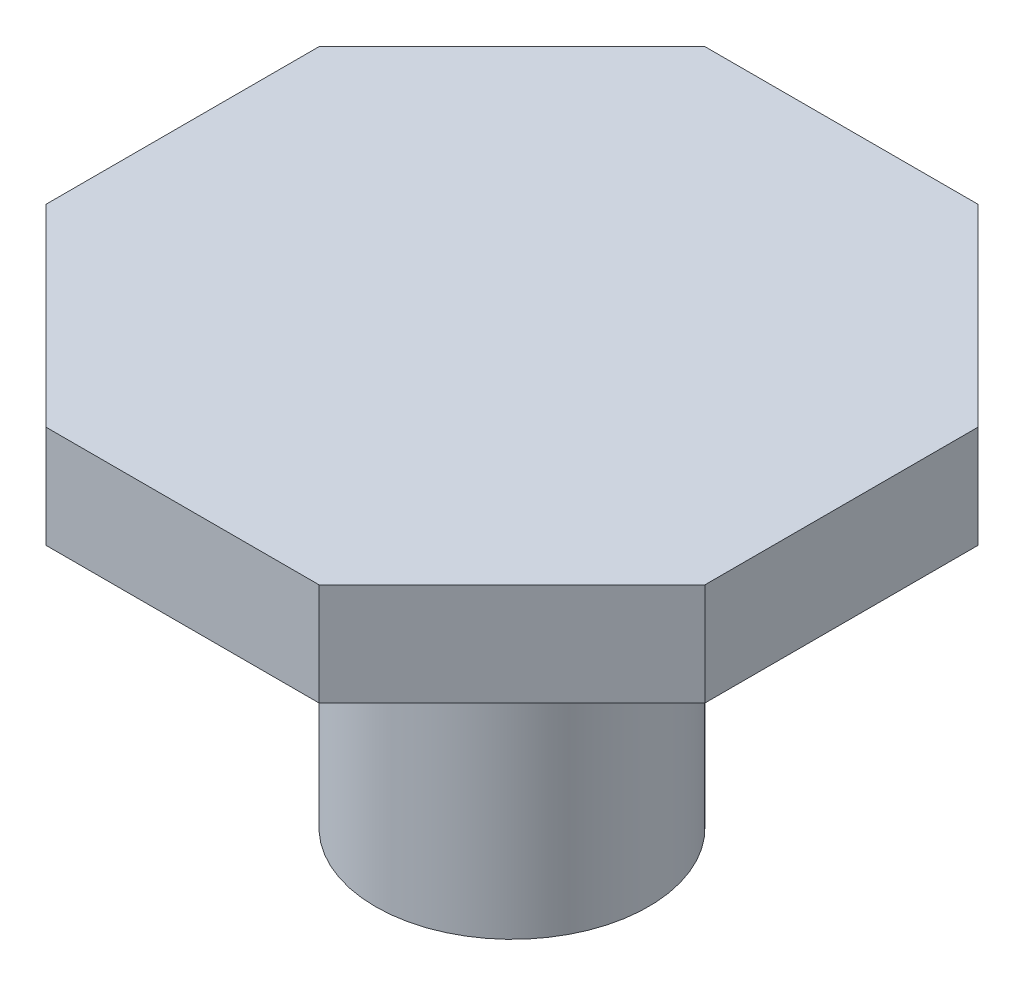
ISO-10303-21;
HEADER;
FILE_DESCRIPTION(('STEP AP214'),'2;1');
FILE_NAME('part.step','',(''),(''),'','','');
FILE_SCHEMA(('AUTOMOTIVE_DESIGN { 1 0 10303 214 1 1 1 1 }'));
ENDSEC;
DATA;
#1=APPLICATION_CONTEXT('core data for automotive mechanical design processes');
#2=APPLICATION_PROTOCOL_DEFINITION('international standard','automotive_design',2000,#1);
#3=PRODUCT_CONTEXT('',#1,'mechanical');
#4=PRODUCT('Part','Part','',(#3));
#5=PRODUCT_RELATED_PRODUCT_CATEGORY('part','',(#4));
#6=PRODUCT_DEFINITION_FORMATION('','',#4);
#7=PRODUCT_DEFINITION_CONTEXT('part definition',#1,'design');
#8=PRODUCT_DEFINITION('design','',#6,#7);
#9=PRODUCT_DEFINITION_SHAPE('','',#8);
#10=(LENGTH_UNIT() NAMED_UNIT(*) SI_UNIT(.MILLI.,.METRE.));
#11=(NAMED_UNIT(*) PLANE_ANGLE_UNIT() SI_UNIT($,.RADIAN.));
#12=(NAMED_UNIT(*) SI_UNIT($,.STERADIAN.) SOLID_ANGLE_UNIT());
#13=UNCERTAINTY_MEASURE_WITH_UNIT(LENGTH_MEASURE(1.E-05),#10,'distance_accuracy_value','');
#14=(GEOMETRIC_REPRESENTATION_CONTEXT(3) GLOBAL_UNCERTAINTY_ASSIGNED_CONTEXT((#13)) GLOBAL_UNIT_ASSIGNED_CONTEXT((#10,
#11,#12)) REPRESENTATION_CONTEXT('',''));
#15=CARTESIAN_POINT('',(0.,0.,0.));
#16=DIRECTION('',(0.,0.,1.));
#17=DIRECTION('',(1.,0.,0.));
#18=AXIS2_PLACEMENT_3D('',#15,#16,#17);
#19=CARTESIAN_POINT('',(0.,5.,0.));
#20=DIRECTION('',(0.,-1.,0.));
#21=DIRECTION('',(0.,0.,-1.));
#22=AXIS2_PLACEMENT_3D('',#19,#20,#21);
#23=CYLINDRICAL_SURFACE('',#22,2.);
#24=CARTESIAN_POINT('',(0.,5.,0.));
#25=DIRECTION('',(0.,1.,0.));
#26=DIRECTION('',(0.,0.,1.));
#27=AXIS2_PLACEMENT_3D('',#24,#25,#26);
#28=CIRCLE('',#27,2.);
#29=CARTESIAN_POINT('',(0.,5.,2.));
#30=VERTEX_POINT('',#29);
#31=EDGE_CURVE('E11',#30,#30,#28,.T.);
#32=ORIENTED_EDGE('',*,*,#31,.F.);
#33=EDGE_LOOP('',(#32));
#34=FACE_BOUND('',#33,.T.);
#35=CARTESIAN_POINT('',(0.,0.,0.));
#36=DIRECTION('',(0.,1.,0.));
#37=DIRECTION('',(0.,0.,1.));
#38=AXIS2_PLACEMENT_3D('',#35,#36,#37);
#39=CIRCLE('',#38,2.);
#40=CARTESIAN_POINT('',(0.,0.,2.));
#41=VERTEX_POINT('',#40);
#42=EDGE_CURVE('E45',#41,#41,#39,.T.);
#43=ORIENTED_EDGE('',*,*,#42,.T.);
#44=EDGE_LOOP('',(#43));
#45=FACE_BOUND('',#44,.T.);
#46=ADVANCED_FACE('F39',(#34,#45),#23,.T.);
#47=CARTESIAN_POINT('',(0.,0.,0.));
#48=DIRECTION('',(0.,1.,0.));
#49=DIRECTION('',(0.,0.,1.));
#50=AXIS2_PLACEMENT_3D('',#47,#48,#49);
#51=PLANE('',#50);
#52=ORIENTED_EDGE('',*,*,#42,.F.);
#53=EDGE_LOOP('',(#52));
#54=FACE_BOUND('',#53,.T.);
#55=ADVANCED_FACE('F170',(#54),#51,.F.);
#56=CARTESIAN_POINT('',(4.82842712474619,6.5,2.));
#57=DIRECTION('',(-1.,0.,0.));
#58=DIRECTION('',(0.,0.,1.));
#59=AXIS2_PLACEMENT_3D('',#56,#57,#58);
#60=PLANE('',#59);
#61=DIRECTION('',(0.,0.,-1.));
#62=VECTOR('',#61,1.);
#63=CARTESIAN_POINT('',(4.82842712474619,5.,2.));
#64=LINE('',#63,#62);
#65=CARTESIAN_POINT('',(4.82842712474619,5.,2.));
#66=VERTEX_POINT('',#65);
#67=CARTESIAN_POINT('',(4.82842712474619,5.,-2.));
#68=VERTEX_POINT('',#67);
#69=EDGE_CURVE('E136',#66,#68,#64,.T.);
#70=ORIENTED_EDGE('',*,*,#69,.T.);
#71=DIRECTION('',(0.,-1.,0.));
#72=VECTOR('',#71,1.);
#73=CARTESIAN_POINT('',(4.82842712474619,6.5,-2.));
#74=LINE('',#73,#72);
#75=CARTESIAN_POINT('',(4.82842712474619,6.5,-2.));
#76=VERTEX_POINT('',#75);
#77=EDGE_CURVE('E161',#76,#68,#74,.T.);
#78=ORIENTED_EDGE('',*,*,#77,.F.);
#79=DIRECTION('',(0.,0.,-1.));
#80=VECTOR('',#79,1.);
#81=CARTESIAN_POINT('',(4.82842712474619,6.5,2.));
#82=LINE('',#81,#80);
#83=CARTESIAN_POINT('',(4.82842712474619,6.5,2.));
#84=VERTEX_POINT('',#83);
#85=EDGE_CURVE('E148',#84,#76,#82,.T.);
#86=ORIENTED_EDGE('',*,*,#85,.F.);
#87=DIRECTION('',(0.,-1.,0.));
#88=VECTOR('',#87,1.);
#89=CARTESIAN_POINT('',(4.82842712474619,6.5,2.));
#90=LINE('',#89,#88);
#91=EDGE_CURVE('E135',#84,#66,#90,.T.);
#92=ORIENTED_EDGE('',*,*,#91,.T.);
#93=EDGE_LOOP('',(#70,#78,#86,#92));
#94=FACE_BOUND('',#93,.T.);
#95=ADVANCED_FACE('F173',(#94),#60,.F.);
#96=CARTESIAN_POINT('',(4.82842712474619,6.5,-2.));
#97=DIRECTION('',(-0.707106781186548,0.,0.707106781186547));
#98=DIRECTION('',(0.707106781186547,0.,0.707106781186548));
#99=AXIS2_PLACEMENT_3D('',#96,#97,#98);
#100=PLANE('',#99);
#101=DIRECTION('',(-0.707106781186547,0.,-0.707106781186548));
#102=VECTOR('',#101,1.);
#103=CARTESIAN_POINT('',(4.82842712474619,5.,-2.));
#104=LINE('',#103,#102);
#105=CARTESIAN_POINT('',(2.,5.,-4.82842712474619));
#106=VERTEX_POINT('',#105);
#107=EDGE_CURVE('E137',#68,#106,#104,.T.);
#108=ORIENTED_EDGE('',*,*,#107,.T.);
#109=DIRECTION('',(0.,-1.,0.));
#110=VECTOR('',#109,1.);
#111=CARTESIAN_POINT('',(2.,6.5,-4.82842712474619));
#112=LINE('',#111,#110);
#113=CARTESIAN_POINT('',(2.,6.5,-4.82842712474619));
#114=VERTEX_POINT('',#113);
#115=EDGE_CURVE('E158',#114,#106,#112,.T.);
#116=ORIENTED_EDGE('',*,*,#115,.F.);
#117=DIRECTION('',(-0.707106781186547,0.,-0.707106781186548));
#118=VECTOR('',#117,1.);
#119=CARTESIAN_POINT('',(4.82842712474619,6.5,-2.));
#120=LINE('',#119,#118);
#121=EDGE_CURVE('E98',#76,#114,#120,.T.);
#122=ORIENTED_EDGE('',*,*,#121,.F.);
#123=ORIENTED_EDGE('',*,*,#77,.T.);
#124=EDGE_LOOP('',(#108,#116,#122,#123));
#125=FACE_BOUND('',#124,.T.);
#126=ADVANCED_FACE('F176',(#125),#100,.F.);
#127=CARTESIAN_POINT('',(2.,6.5,-4.82842712474619));
#128=DIRECTION('',(0.,0.,1.));
#129=DIRECTION('',(1.,0.,0.));
#130=AXIS2_PLACEMENT_3D('',#127,#128,#129);
#131=PLANE('',#130);
#132=DIRECTION('',(-1.,0.,0.));
#133=VECTOR('',#132,1.);
#134=CARTESIAN_POINT('',(2.,5.,-4.82842712474619));
#135=LINE('',#134,#133);
#136=CARTESIAN_POINT('',(-2.,5.,-4.82842712474619));
#137=VERTEX_POINT('',#136);
#138=EDGE_CURVE('E141',#106,#137,#135,.T.);
#139=ORIENTED_EDGE('',*,*,#138,.T.);
#140=DIRECTION('',(0.,-1.,0.));
#141=VECTOR('',#140,1.);
#142=CARTESIAN_POINT('',(-2.,6.5,-4.82842712474619));
#143=LINE('',#142,#141);
#144=CARTESIAN_POINT('',(-2.,6.5,-4.82842712474619));
#145=VERTEX_POINT('',#144);
#146=EDGE_CURVE('E160',#145,#137,#143,.T.);
#147=ORIENTED_EDGE('',*,*,#146,.F.);
#148=DIRECTION('',(-1.,0.,0.));
#149=VECTOR('',#148,1.);
#150=CARTESIAN_POINT('',(2.,6.5,-4.82842712474619));
#151=LINE('',#150,#149);
#152=EDGE_CURVE('E284',#114,#145,#151,.T.);
#153=ORIENTED_EDGE('',*,*,#152,.F.);
#154=ORIENTED_EDGE('',*,*,#115,.T.);
#155=EDGE_LOOP('',(#139,#147,#153,#154));
#156=FACE_BOUND('',#155,.T.);
#157=ADVANCED_FACE('F183',(#156),#131,.F.);
#158=CARTESIAN_POINT('',(-2.,6.5,-4.82842712474619));
#159=DIRECTION('',(0.707106781186547,0.,0.707106781186548));
#160=DIRECTION('',(0.707106781186548,0.,-0.707106781186547));
#161=AXIS2_PLACEMENT_3D('',#158,#159,#160);
#162=PLANE('',#161);
#163=DIRECTION('',(-0.707106781186548,0.,0.707106781186547));
#164=VECTOR('',#163,1.);
#165=CARTESIAN_POINT('',(-2.,5.,-4.82842712474619));
#166=LINE('',#165,#164);
#167=CARTESIAN_POINT('',(-4.82842712474619,5.,-2.));
#168=VERTEX_POINT('',#167);
#169=EDGE_CURVE('E142',#137,#168,#166,.T.);
#170=ORIENTED_EDGE('',*,*,#169,.T.);
#171=DIRECTION('',(0.,-1.,0.));
#172=VECTOR('',#171,1.);
#173=CARTESIAN_POINT('',(-4.82842712474619,6.5,-2.));
#174=LINE('',#173,#172);
#175=CARTESIAN_POINT('',(-4.82842712474619,6.5,-2.));
#176=VERTEX_POINT('',#175);
#177=EDGE_CURVE('E152',#176,#168,#174,.T.);
#178=ORIENTED_EDGE('',*,*,#177,.F.);
#179=DIRECTION('',(-0.707106781186548,0.,0.707106781186547));
#180=VECTOR('',#179,1.);
#181=CARTESIAN_POINT('',(-2.,6.5,-4.82842712474619));
#182=LINE('',#181,#180);
#183=EDGE_CURVE('E290',#145,#176,#182,.T.);
#184=ORIENTED_EDGE('',*,*,#183,.F.);
#185=ORIENTED_EDGE('',*,*,#146,.T.);
#186=EDGE_LOOP('',(#170,#178,#184,#185));
#187=FACE_BOUND('',#186,.T.);
#188=ADVANCED_FACE('F186',(#187),#162,.F.);
#189=CARTESIAN_POINT('',(-4.82842712474619,6.5,-2.));
#190=DIRECTION('',(1.,0.,0.));
#191=DIRECTION('',(0.,0.,-1.));
#192=AXIS2_PLACEMENT_3D('',#189,#190,#191);
#193=PLANE('',#192);
#194=DIRECTION('',(0.,0.,1.));
#195=VECTOR('',#194,1.);
#196=CARTESIAN_POINT('',(-4.82842712474619,5.,-2.));
#197=LINE('',#196,#195);
#198=CARTESIAN_POINT('',(-4.82842712474619,5.,2.));
#199=VERTEX_POINT('',#198);
#200=EDGE_CURVE('E144',#168,#199,#197,.T.);
#201=ORIENTED_EDGE('',*,*,#200,.T.);
#202=DIRECTION('',(0.,-1.,0.));
#203=VECTOR('',#202,1.);
#204=CARTESIAN_POINT('',(-4.82842712474619,6.5,2.));
#205=LINE('',#204,#203);
#206=CARTESIAN_POINT('',(-4.82842712474619,6.5,2.));
#207=VERTEX_POINT('',#206);
#208=EDGE_CURVE('E130',#207,#199,#205,.T.);
#209=ORIENTED_EDGE('',*,*,#208,.F.);
#210=DIRECTION('',(0.,0.,1.));
#211=VECTOR('',#210,1.);
#212=CARTESIAN_POINT('',(-4.82842712474619,6.5,-2.));
#213=LINE('',#212,#211);
#214=EDGE_CURVE('E116',#176,#207,#213,.T.);
#215=ORIENTED_EDGE('',*,*,#214,.F.);
#216=ORIENTED_EDGE('',*,*,#177,.T.);
#217=EDGE_LOOP('',(#201,#209,#215,#216));
#218=FACE_BOUND('',#217,.T.);
#219=ADVANCED_FACE('F189',(#218),#193,.F.);
#220=CARTESIAN_POINT('',(-4.82842712474619,6.5,2.));
#221=DIRECTION('',(0.707106781186547,0.,-0.707106781186548));
#222=DIRECTION('',(-0.707106781186548,0.,-0.707106781186547));
#223=AXIS2_PLACEMENT_3D('',#220,#221,#222);
#224=PLANE('',#223);
#225=DIRECTION('',(0.707106781186548,0.,0.707106781186547));
#226=VECTOR('',#225,1.);
#227=CARTESIAN_POINT('',(-4.82842712474619,5.,2.));
#228=LINE('',#227,#226);
#229=CARTESIAN_POINT('',(-2.,5.,4.8284271247462));
#230=VERTEX_POINT('',#229);
#231=EDGE_CURVE('E128',#199,#230,#228,.T.);
#232=ORIENTED_EDGE('',*,*,#231,.T.);
#233=DIRECTION('',(0.,-1.,0.));
#234=VECTOR('',#233,1.);
#235=CARTESIAN_POINT('',(-2.,6.5,4.8284271247462));
#236=LINE('',#235,#234);
#237=CARTESIAN_POINT('',(-2.,6.5,4.8284271247462));
#238=VERTEX_POINT('',#237);
#239=EDGE_CURVE('E121',#238,#230,#236,.T.);
#240=ORIENTED_EDGE('',*,*,#239,.F.);
#241=DIRECTION('',(0.707106781186548,0.,0.707106781186547));
#242=VECTOR('',#241,1.);
#243=CARTESIAN_POINT('',(-4.82842712474619,6.5,2.));
#244=LINE('',#243,#242);
#245=EDGE_CURVE('E115',#207,#238,#244,.T.);
#246=ORIENTED_EDGE('',*,*,#245,.F.);
#247=ORIENTED_EDGE('',*,*,#208,.T.);
#248=EDGE_LOOP('',(#232,#240,#246,#247));
#249=FACE_BOUND('',#248,.T.);
#250=ADVANCED_FACE('F125',(#249),#224,.F.);
#251=CARTESIAN_POINT('',(-2.,6.5,4.8284271247462));
#252=DIRECTION('',(0.,0.,-1.));
#253=DIRECTION('',(-1.,0.,0.));
#254=AXIS2_PLACEMENT_3D('',#251,#252,#253);
#255=PLANE('',#254);
#256=DIRECTION('',(1.,0.,0.));
#257=VECTOR('',#256,1.);
#258=CARTESIAN_POINT('',(-2.,5.,4.8284271247462));
#259=LINE('',#258,#257);
#260=CARTESIAN_POINT('',(2.,5.,4.8284271247462));
#261=VERTEX_POINT('',#260);
#262=EDGE_CURVE('E84',#230,#261,#259,.T.);
#263=ORIENTED_EDGE('',*,*,#262,.T.);
#264=DIRECTION('',(0.,-1.,0.));
#265=VECTOR('',#264,1.);
#266=CARTESIAN_POINT('',(2.,6.5,4.8284271247462));
#267=LINE('',#266,#265);
#268=CARTESIAN_POINT('',(2.,6.5,4.8284271247462));
#269=VERTEX_POINT('',#268);
#270=EDGE_CURVE('E126',#269,#261,#267,.T.);
#271=ORIENTED_EDGE('',*,*,#270,.F.);
#272=DIRECTION('',(1.,0.,0.));
#273=VECTOR('',#272,1.);
#274=CARTESIAN_POINT('',(-2.,6.5,4.8284271247462));
#275=LINE('',#274,#273);
#276=EDGE_CURVE('E118',#238,#269,#275,.T.);
#277=ORIENTED_EDGE('',*,*,#276,.F.);
#278=ORIENTED_EDGE('',*,*,#239,.T.);
#279=EDGE_LOOP('',(#263,#271,#277,#278));
#280=FACE_BOUND('',#279,.T.);
#281=ADVANCED_FACE('F127',(#280),#255,.F.);
#282=CARTESIAN_POINT('',(2.,6.5,4.8284271247462));
#283=DIRECTION('',(-0.707106781186547,0.,-0.707106781186548));
#284=DIRECTION('',(-0.707106781186548,0.,0.707106781186547));
#285=AXIS2_PLACEMENT_3D('',#282,#283,#284);
#286=PLANE('',#285);
#287=DIRECTION('',(0.707106781186548,0.,-0.707106781186547));
#288=VECTOR('',#287,1.);
#289=CARTESIAN_POINT('',(2.,5.,4.8284271247462));
#290=LINE('',#289,#288);
#291=EDGE_CURVE('E89',#261,#66,#290,.T.);
#292=ORIENTED_EDGE('',*,*,#291,.T.);
#293=ORIENTED_EDGE('',*,*,#91,.F.);
#294=DIRECTION('',(0.707106781186548,0.,-0.707106781186547));
#295=VECTOR('',#294,1.);
#296=CARTESIAN_POINT('',(2.,6.5,4.8284271247462));
#297=LINE('',#296,#295);
#298=EDGE_CURVE('E54',#269,#84,#297,.T.);
#299=ORIENTED_EDGE('',*,*,#298,.F.);
#300=ORIENTED_EDGE('',*,*,#270,.T.);
#301=EDGE_LOOP('',(#292,#293,#299,#300));
#302=FACE_BOUND('',#301,.T.);
#303=ADVANCED_FACE('F197',(#302),#286,.F.);
#304=CARTESIAN_POINT('',(0.,6.5,0.));
#305=DIRECTION('',(0.,1.,0.));
#306=DIRECTION('',(0.,0.,1.));
#307=AXIS2_PLACEMENT_3D('',#304,#305,#306);
#308=PLANE('',#307);
#309=ORIENTED_EDGE('',*,*,#85,.T.);
#310=ORIENTED_EDGE('',*,*,#121,.T.);
#311=ORIENTED_EDGE('',*,*,#152,.T.);
#312=ORIENTED_EDGE('',*,*,#183,.T.);
#313=ORIENTED_EDGE('',*,*,#214,.T.);
#314=ORIENTED_EDGE('',*,*,#245,.T.);
#315=ORIENTED_EDGE('',*,*,#276,.T.);
#316=ORIENTED_EDGE('',*,*,#298,.T.);
#317=EDGE_LOOP('',(#309,#310,#311,#312,#313,#314,#315,#316));
#318=FACE_BOUND('',#317,.T.);
#319=ADVANCED_FACE('F114',(#318),#308,.T.);
#320=CARTESIAN_POINT('',(0.,5.,0.));
#321=DIRECTION('',(0.,1.,0.));
#322=DIRECTION('',(0.,0.,1.));
#323=AXIS2_PLACEMENT_3D('',#320,#321,#322);
#324=PLANE('',#323);
#325=ORIENTED_EDGE('',*,*,#31,.T.);
#326=EDGE_LOOP('',(#325));
#327=FACE_BOUND('',#326,.T.);
#328=ORIENTED_EDGE('',*,*,#69,.F.);
#329=ORIENTED_EDGE('',*,*,#291,.F.);
#330=ORIENTED_EDGE('',*,*,#262,.F.);
#331=ORIENTED_EDGE('',*,*,#231,.F.);
#332=ORIENTED_EDGE('',*,*,#200,.F.);
#333=ORIENTED_EDGE('',*,*,#169,.F.);
#334=ORIENTED_EDGE('',*,*,#138,.F.);
#335=ORIENTED_EDGE('',*,*,#107,.F.);
#336=EDGE_LOOP('',(#328,#329,#330,#331,#332,#333,#334,#335));
#337=FACE_BOUND('',#336,.T.);
#338=ADVANCED_FACE('F205',(#327,#337),#324,.F.);
#339=CLOSED_SHELL('',(#46,#55,#95,#126,#157,#188,#219,#250,#281,#303,#319,#338));
#340=MANIFOLD_SOLID_BREP('B2',#339);
#341=ADVANCED_BREP_SHAPE_REPRESENTATION('',(#18,#340),#14);
#342=SHAPE_DEFINITION_REPRESENTATION(#9,#341);
ENDSEC;
END-ISO-10303-21;
